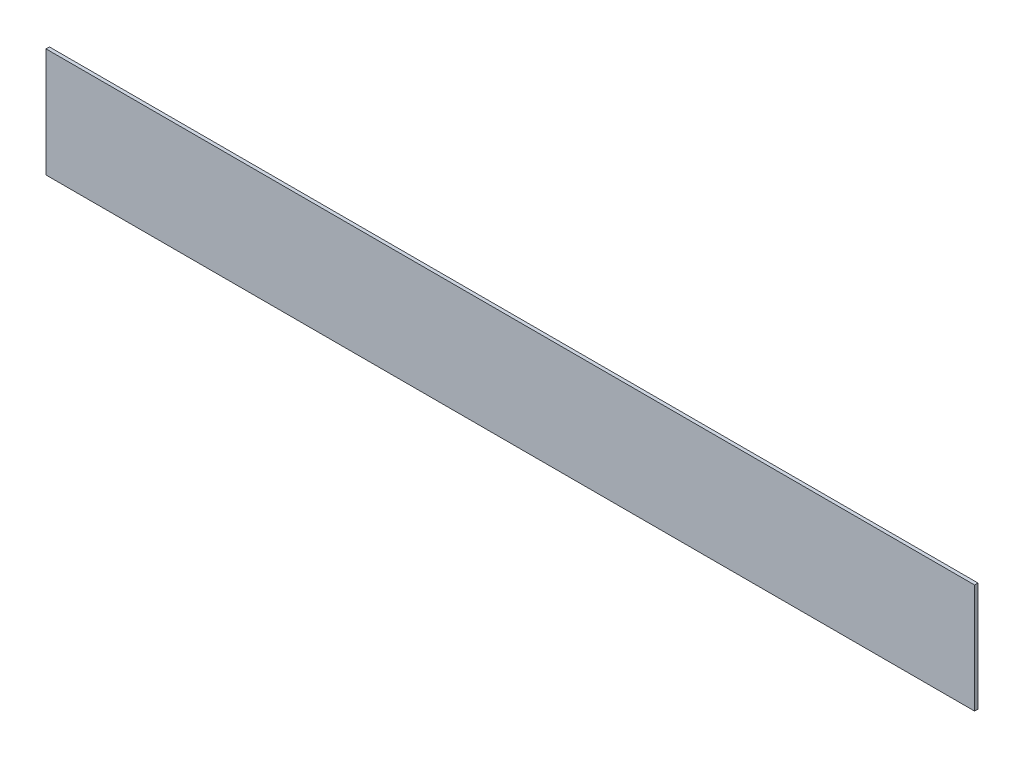
ISO-10303-21;
HEADER;
FILE_DESCRIPTION(('STEP AP214'),'2;1');
FILE_NAME('part.step','',(''),(''),'','','');
FILE_SCHEMA(('AUTOMOTIVE_DESIGN { 1 0 10303 214 1 1 1 1 }'));
ENDSEC;
DATA;
#1=APPLICATION_CONTEXT('core data for automotive mechanical design processes');
#2=APPLICATION_PROTOCOL_DEFINITION('international standard','automotive_design',2000,#1);
#3=PRODUCT_CONTEXT('',#1,'mechanical');
#4=PRODUCT('Part','Part','',(#3));
#5=PRODUCT_RELATED_PRODUCT_CATEGORY('part','',(#4));
#6=PRODUCT_DEFINITION_FORMATION('','',#4);
#7=PRODUCT_DEFINITION_CONTEXT('part definition',#1,'design');
#8=PRODUCT_DEFINITION('design','',#6,#7);
#9=PRODUCT_DEFINITION_SHAPE('','',#8);
#10=(LENGTH_UNIT() NAMED_UNIT(*) SI_UNIT(.MILLI.,.METRE.));
#11=(NAMED_UNIT(*) PLANE_ANGLE_UNIT() SI_UNIT($,.RADIAN.));
#12=(NAMED_UNIT(*) SI_UNIT($,.STERADIAN.) SOLID_ANGLE_UNIT());
#13=UNCERTAINTY_MEASURE_WITH_UNIT(LENGTH_MEASURE(1.E-05),#10,'distance_accuracy_value','');
#14=(GEOMETRIC_REPRESENTATION_CONTEXT(3) GLOBAL_UNCERTAINTY_ASSIGNED_CONTEXT((#13)) GLOBAL_UNIT_ASSIGNED_CONTEXT((#10,
#11,#12)) REPRESENTATION_CONTEXT('',''));
#15=CARTESIAN_POINT('',(0.,0.,0.));
#16=DIRECTION('',(0.,0.,1.));
#17=DIRECTION('',(1.,0.,0.));
#18=AXIS2_PLACEMENT_3D('',#15,#16,#17);
#19=CARTESIAN_POINT('',(0.,0.,1.5875));
#20=DIRECTION('',(0.,1.,0.));
#21=DIRECTION('',(0.,0.,1.));
#22=AXIS2_PLACEMENT_3D('',#19,#20,#21);
#23=PLANE('',#22);
#24=DIRECTION('',(1.,0.,0.));
#25=VECTOR('',#24,1.);
#26=CARTESIAN_POINT('',(0.,0.,0.));
#27=LINE('',#26,#25);
#28=CARTESIAN_POINT('',(0.,0.,0.));
#29=VERTEX_POINT('',#28);
#30=CARTESIAN_POINT('',(431.8,0.,0.));
#31=VERTEX_POINT('',#30);
#32=EDGE_CURVE('E97',#29,#31,#27,.T.);
#33=ORIENTED_EDGE('',*,*,#32,.T.);
#34=DIRECTION('',(0.,0.,-1.));
#35=VECTOR('',#34,1.);
#36=CARTESIAN_POINT('',(431.8,0.,1.5875));
#37=LINE('',#36,#35);
#38=CARTESIAN_POINT('',(431.8,0.,1.5875));
#39=VERTEX_POINT('',#38);
#40=EDGE_CURVE('E11',#39,#31,#37,.T.);
#41=ORIENTED_EDGE('',*,*,#40,.F.);
#42=DIRECTION('',(1.,0.,0.));
#43=VECTOR('',#42,1.);
#44=CARTESIAN_POINT('',(0.,0.,1.5875));
#45=LINE('',#44,#43);
#46=CARTESIAN_POINT('',(0.,0.,1.5875));
#47=VERTEX_POINT('',#46);
#48=EDGE_CURVE('E85',#47,#39,#45,.T.);
#49=ORIENTED_EDGE('',*,*,#48,.F.);
#50=DIRECTION('',(0.,0.,-1.));
#51=VECTOR('',#50,1.);
#52=CARTESIAN_POINT('',(0.,0.,1.5875));
#53=LINE('',#52,#51);
#54=EDGE_CURVE('E93',#47,#29,#53,.T.);
#55=ORIENTED_EDGE('',*,*,#54,.T.);
#56=EDGE_LOOP('',(#33,#41,#49,#55));
#57=FACE_BOUND('',#56,.T.);
#58=ADVANCED_FACE('F34',(#57),#23,.F.);
#59=CARTESIAN_POINT('',(431.8,0.,1.5875));
#60=DIRECTION('',(-1.,0.,0.));
#61=DIRECTION('',(0.,0.,1.));
#62=AXIS2_PLACEMENT_3D('',#59,#60,#61);
#63=PLANE('',#62);
#64=DIRECTION('',(0.,1.,0.));
#65=VECTOR('',#64,1.);
#66=CARTESIAN_POINT('',(431.8,0.,0.));
#67=LINE('',#66,#65);
#68=CARTESIAN_POINT('',(431.8,50.8,0.));
#69=VERTEX_POINT('',#68);
#70=EDGE_CURVE('E89',#31,#69,#67,.T.);
#71=ORIENTED_EDGE('',*,*,#70,.T.);
#72=DIRECTION('',(0.,0.,-1.));
#73=VECTOR('',#72,1.);
#74=CARTESIAN_POINT('',(431.8,50.8,1.5875));
#75=LINE('',#74,#73);
#76=CARTESIAN_POINT('',(431.8,50.8,1.5875));
#77=VERTEX_POINT('',#76);
#78=EDGE_CURVE('E42',#77,#69,#75,.T.);
#79=ORIENTED_EDGE('',*,*,#78,.F.);
#80=DIRECTION('',(0.,1.,0.));
#81=VECTOR('',#80,1.);
#82=CARTESIAN_POINT('',(431.8,0.,1.5875));
#83=LINE('',#82,#81);
#84=EDGE_CURVE('E80',#39,#77,#83,.T.);
#85=ORIENTED_EDGE('',*,*,#84,.F.);
#86=ORIENTED_EDGE('',*,*,#40,.T.);
#87=EDGE_LOOP('',(#71,#79,#85,#86));
#88=FACE_BOUND('',#87,.T.);
#89=ADVANCED_FACE('F88',(#88),#63,.F.);
#90=CARTESIAN_POINT('',(0.,50.8,1.5875));
#91=DIRECTION('',(0.,-1.,0.));
#92=DIRECTION('',(0.,0.,-1.));
#93=AXIS2_PLACEMENT_3D('',#90,#91,#92);
#94=PLANE('',#93);
#95=DIRECTION('',(-1.,0.,0.));
#96=VECTOR('',#95,1.);
#97=CARTESIAN_POINT('',(0.,50.8,0.));
#98=LINE('',#97,#96);
#99=CARTESIAN_POINT('',(0.,50.8,0.));
#100=VERTEX_POINT('',#99);
#101=EDGE_CURVE('E67',#69,#100,#98,.T.);
#102=ORIENTED_EDGE('',*,*,#101,.T.);
#103=DIRECTION('',(0.,0.,-1.));
#104=VECTOR('',#103,1.);
#105=CARTESIAN_POINT('',(0.,50.8,1.5875));
#106=LINE('',#105,#104);
#107=CARTESIAN_POINT('',(0.,50.8,1.5875));
#108=VERTEX_POINT('',#107);
#109=EDGE_CURVE('E90',#108,#100,#106,.T.);
#110=ORIENTED_EDGE('',*,*,#109,.F.);
#111=DIRECTION('',(-1.,0.,0.));
#112=VECTOR('',#111,1.);
#113=CARTESIAN_POINT('',(0.,50.8,1.5875));
#114=LINE('',#113,#112);
#115=EDGE_CURVE('E83',#77,#108,#114,.T.);
#116=ORIENTED_EDGE('',*,*,#115,.F.);
#117=ORIENTED_EDGE('',*,*,#78,.T.);
#118=EDGE_LOOP('',(#102,#110,#116,#117));
#119=FACE_BOUND('',#118,.T.);
#120=ADVANCED_FACE('F91',(#119),#94,.F.);
#121=CARTESIAN_POINT('',(0.,0.,1.5875));
#122=DIRECTION('',(1.,0.,0.));
#123=DIRECTION('',(0.,0.,-1.));
#124=AXIS2_PLACEMENT_3D('',#121,#122,#123);
#125=PLANE('',#124);
#126=DIRECTION('',(0.,-1.,0.));
#127=VECTOR('',#126,1.);
#128=CARTESIAN_POINT('',(0.,0.,0.));
#129=LINE('',#128,#127);
#130=EDGE_CURVE('E73',#100,#29,#129,.T.);
#131=ORIENTED_EDGE('',*,*,#130,.T.);
#132=ORIENTED_EDGE('',*,*,#54,.F.);
#133=DIRECTION('',(0.,-1.,0.));
#134=VECTOR('',#133,1.);
#135=CARTESIAN_POINT('',(0.,0.,1.5875));
#136=LINE('',#135,#134);
#137=EDGE_CURVE('E50',#108,#47,#136,.T.);
#138=ORIENTED_EDGE('',*,*,#137,.F.);
#139=ORIENTED_EDGE('',*,*,#109,.T.);
#140=EDGE_LOOP('',(#131,#132,#138,#139));
#141=FACE_BOUND('',#140,.T.);
#142=ADVANCED_FACE('F104',(#141),#125,.F.);
#143=CARTESIAN_POINT('',(0.,0.,1.5875));
#144=DIRECTION('',(0.,0.,1.));
#145=DIRECTION('',(1.,0.,0.));
#146=AXIS2_PLACEMENT_3D('',#143,#144,#145);
#147=PLANE('',#146);
#148=ORIENTED_EDGE('',*,*,#48,.T.);
#149=ORIENTED_EDGE('',*,*,#84,.T.);
#150=ORIENTED_EDGE('',*,*,#115,.T.);
#151=ORIENTED_EDGE('',*,*,#137,.T.);
#152=EDGE_LOOP('',(#148,#149,#150,#151));
#153=FACE_BOUND('',#152,.T.);
#154=ADVANCED_FACE('F81',(#153),#147,.T.);
#155=CARTESIAN_POINT('',(0.,0.,0.));
#156=DIRECTION('',(0.,0.,1.));
#157=DIRECTION('',(1.,0.,0.));
#158=AXIS2_PLACEMENT_3D('',#155,#156,#157);
#159=PLANE('',#158);
#160=ORIENTED_EDGE('',*,*,#32,.F.);
#161=ORIENTED_EDGE('',*,*,#130,.F.);
#162=ORIENTED_EDGE('',*,*,#101,.F.);
#163=ORIENTED_EDGE('',*,*,#70,.F.);
#164=EDGE_LOOP('',(#160,#161,#162,#163));
#165=FACE_BOUND('',#164,.T.);
#166=ADVANCED_FACE('F107',(#165),#159,.F.);
#167=CLOSED_SHELL('',(#58,#89,#120,#142,#154,#166));
#168=MANIFOLD_SOLID_BREP('B2',#167);
#169=ADVANCED_BREP_SHAPE_REPRESENTATION('',(#18,#168),#14);
#170=SHAPE_DEFINITION_REPRESENTATION(#9,#169);
ENDSEC;
END-ISO-10303-21;
